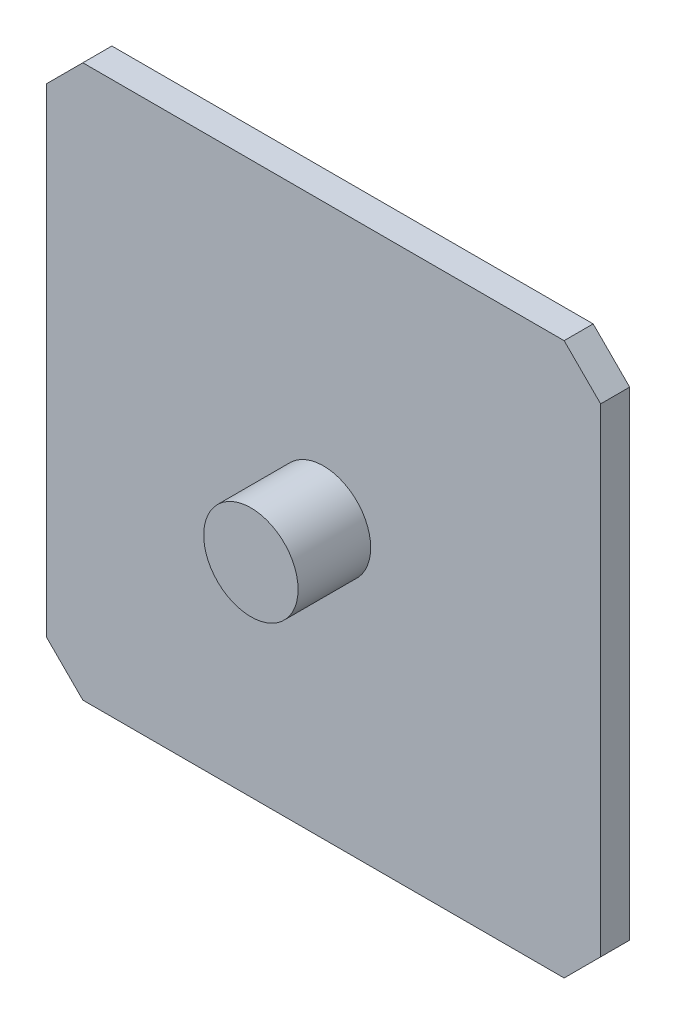
ISO-10303-21;
HEADER;
FILE_DESCRIPTION(('STEP AP214'),'2;1');
FILE_NAME('part.step','',(''),(''),'','','');
FILE_SCHEMA(('AUTOMOTIVE_DESIGN { 1 0 10303 214 1 1 1 1 }'));
ENDSEC;
DATA;
#1=APPLICATION_CONTEXT('core data for automotive mechanical design processes');
#2=APPLICATION_PROTOCOL_DEFINITION('international standard','automotive_design',2000,#1);
#3=PRODUCT_CONTEXT('',#1,'mechanical');
#4=PRODUCT('Part','Part','',(#3));
#5=PRODUCT_RELATED_PRODUCT_CATEGORY('part','',(#4));
#6=PRODUCT_DEFINITION_FORMATION('','',#4);
#7=PRODUCT_DEFINITION_CONTEXT('part definition',#1,'design');
#8=PRODUCT_DEFINITION('design','',#6,#7);
#9=PRODUCT_DEFINITION_SHAPE('','',#8);
#10=(LENGTH_UNIT() NAMED_UNIT(*) SI_UNIT(.MILLI.,.METRE.));
#11=(NAMED_UNIT(*) PLANE_ANGLE_UNIT() SI_UNIT($,.RADIAN.));
#12=(NAMED_UNIT(*) SI_UNIT($,.STERADIAN.) SOLID_ANGLE_UNIT());
#13=UNCERTAINTY_MEASURE_WITH_UNIT(LENGTH_MEASURE(1.E-05),#10,'distance_accuracy_value','');
#14=(GEOMETRIC_REPRESENTATION_CONTEXT(3) GLOBAL_UNCERTAINTY_ASSIGNED_CONTEXT((#13)) GLOBAL_UNIT_ASSIGNED_CONTEXT((#10,
#11,#12)) REPRESENTATION_CONTEXT('',''));
#15=CARTESIAN_POINT('',(0.,0.,0.));
#16=DIRECTION('',(0.,0.,1.));
#17=DIRECTION('',(1.,0.,0.));
#18=AXIS2_PLACEMENT_3D('',#15,#16,#17);
#19=CARTESIAN_POINT('',(16.5751975961023,-19.0093329427343,2.));
#20=DIRECTION('',(-0.707106781186547,0.707106781186547,0.));
#21=DIRECTION('',(-0.707106781186548,-0.707106781186548,0.));
#22=AXIS2_PLACEMENT_3D('',#19,#20,#21);
#23=PLANE('',#22);
#24=DIRECTION('',(0.707106781186548,0.707106781186548,0.));
#25=VECTOR('',#24,1.);
#26=CARTESIAN_POINT('',(16.5751975961023,-19.0093329427343,0.));
#27=LINE('',#26,#25);
#28=CARTESIAN_POINT('',(16.5751975961023,-19.0093329427343,0.));
#29=VERTEX_POINT('',#28);
#30=CARTESIAN_POINT('',(19.0897975961023,-16.4947329427343,0.));
#31=VERTEX_POINT('',#30);
#32=EDGE_CURVE('E129',#29,#31,#27,.T.);
#33=ORIENTED_EDGE('',*,*,#32,.T.);
#34=DIRECTION('',(0.,0.,-1.));
#35=VECTOR('',#34,1.);
#36=CARTESIAN_POINT('',(19.0897975961023,-16.4947329427343,2.));
#37=LINE('',#36,#35);
#38=CARTESIAN_POINT('',(19.0897975961023,-16.4947329427343,2.));
#39=VERTEX_POINT('',#38);
#40=EDGE_CURVE('E11',#39,#31,#37,.T.);
#41=ORIENTED_EDGE('',*,*,#40,.F.);
#42=DIRECTION('',(0.707106781186548,0.707106781186548,0.));
#43=VECTOR('',#42,1.);
#44=CARTESIAN_POINT('',(16.5751975961023,-19.0093329427343,2.));
#45=LINE('',#44,#43);
#46=CARTESIAN_POINT('',(16.5751975961023,-19.0093329427343,2.));
#47=VERTEX_POINT('',#46);
#48=EDGE_CURVE('E144',#47,#39,#45,.T.);
#49=ORIENTED_EDGE('',*,*,#48,.F.);
#50=DIRECTION('',(0.,0.,-1.));
#51=VECTOR('',#50,1.);
#52=CARTESIAN_POINT('',(16.5751975961023,-19.0093329427343,2.));
#53=LINE('',#52,#51);
#54=EDGE_CURVE('E125',#47,#29,#53,.T.);
#55=ORIENTED_EDGE('',*,*,#54,.T.);
#56=EDGE_LOOP('',(#33,#41,#49,#55));
#57=FACE_BOUND('',#56,.T.);
#58=ADVANCED_FACE('F33',(#57),#23,.F.);
#59=CARTESIAN_POINT('',(19.0897975961023,-16.4947329427343,2.));
#60=DIRECTION('',(-1.,0.,0.));
#61=DIRECTION('',(0.,0.,1.));
#62=AXIS2_PLACEMENT_3D('',#59,#60,#61);
#63=PLANE('',#62);
#64=DIRECTION('',(0.,1.,0.));
#65=VECTOR('',#64,1.);
#66=CARTESIAN_POINT('',(19.0897975961023,-16.4947329427343,0.));
#67=LINE('',#66,#65);
#68=CARTESIAN_POINT('',(19.0897975961023,16.4947329427343,0.));
#69=VERTEX_POINT('',#68);
#70=EDGE_CURVE('E132',#31,#69,#67,.T.);
#71=ORIENTED_EDGE('',*,*,#70,.T.);
#72=DIRECTION('',(0.,0.,-1.));
#73=VECTOR('',#72,1.);
#74=CARTESIAN_POINT('',(19.0897975961023,16.4947329427343,2.));
#75=LINE('',#74,#73);
#76=CARTESIAN_POINT('',(19.0897975961023,16.4947329427343,2.));
#77=VERTEX_POINT('',#76);
#78=EDGE_CURVE('E41',#77,#69,#75,.T.);
#79=ORIENTED_EDGE('',*,*,#78,.F.);
#80=DIRECTION('',(0.,1.,0.));
#81=VECTOR('',#80,1.);
#82=CARTESIAN_POINT('',(19.0897975961023,-16.4947329427343,2.));
#83=LINE('',#82,#81);
#84=EDGE_CURVE('E92',#39,#77,#83,.T.);
#85=ORIENTED_EDGE('',*,*,#84,.F.);
#86=ORIENTED_EDGE('',*,*,#40,.T.);
#87=EDGE_LOOP('',(#71,#79,#85,#86));
#88=FACE_BOUND('',#87,.T.);
#89=ADVANCED_FACE('F201',(#88),#63,.F.);
#90=CARTESIAN_POINT('',(19.0897975961023,16.4947329427343,2.));
#91=DIRECTION('',(-0.707106781186547,-0.707106781186547,0.));
#92=DIRECTION('',(0.707106781186548,-0.707106781186548,0.));
#93=AXIS2_PLACEMENT_3D('',#90,#91,#92);
#94=PLANE('',#93);
#95=DIRECTION('',(-0.707106781186548,0.707106781186548,0.));
#96=VECTOR('',#95,1.);
#97=CARTESIAN_POINT('',(19.0897975961023,16.4947329427343,0.));
#98=LINE('',#97,#96);
#99=CARTESIAN_POINT('',(16.5751975961023,19.0093329427343,0.));
#100=VERTEX_POINT('',#99);
#101=EDGE_CURVE('E135',#69,#100,#98,.T.);
#102=ORIENTED_EDGE('',*,*,#101,.T.);
#103=DIRECTION('',(0.,0.,-1.));
#104=VECTOR('',#103,1.);
#105=CARTESIAN_POINT('',(16.5751975961023,19.0093329427343,2.));
#106=LINE('',#105,#104);
#107=CARTESIAN_POINT('',(16.5751975961023,19.0093329427343,2.));
#108=VERTEX_POINT('',#107);
#109=EDGE_CURVE('E151',#108,#100,#106,.T.);
#110=ORIENTED_EDGE('',*,*,#109,.F.);
#111=DIRECTION('',(-0.707106781186548,0.707106781186548,0.));
#112=VECTOR('',#111,1.);
#113=CARTESIAN_POINT('',(19.0897975961023,16.4947329427343,2.));
#114=LINE('',#113,#112);
#115=EDGE_CURVE('E159',#77,#108,#114,.T.);
#116=ORIENTED_EDGE('',*,*,#115,.F.);
#117=ORIENTED_EDGE('',*,*,#78,.T.);
#118=EDGE_LOOP('',(#102,#110,#116,#117));
#119=FACE_BOUND('',#118,.T.);
#120=ADVANCED_FACE('F157',(#119),#94,.F.);
#121=CARTESIAN_POINT('',(16.5751975961023,19.0093329427343,2.));
#122=DIRECTION('',(0.,-1.,0.));
#123=DIRECTION('',(0.,0.,-1.));
#124=AXIS2_PLACEMENT_3D('',#121,#122,#123);
#125=PLANE('',#124);
#126=DIRECTION('',(-1.,0.,0.));
#127=VECTOR('',#126,1.);
#128=CARTESIAN_POINT('',(16.5751975961023,19.0093329427343,0.));
#129=LINE('',#128,#127);
#130=CARTESIAN_POINT('',(-16.5751975961023,19.0093329427343,0.));
#131=VERTEX_POINT('',#130);
#132=EDGE_CURVE('E137',#100,#131,#129,.T.);
#133=ORIENTED_EDGE('',*,*,#132,.T.);
#134=DIRECTION('',(0.,0.,-1.));
#135=VECTOR('',#134,1.);
#136=CARTESIAN_POINT('',(-16.5751975961023,19.0093329427343,2.));
#137=LINE('',#136,#135);
#138=CARTESIAN_POINT('',(-16.5751975961023,19.0093329427343,2.));
#139=VERTEX_POINT('',#138);
#140=EDGE_CURVE('E148',#139,#131,#137,.T.);
#141=ORIENTED_EDGE('',*,*,#140,.F.);
#142=DIRECTION('',(-1.,0.,0.));
#143=VECTOR('',#142,1.);
#144=CARTESIAN_POINT('',(16.5751975961023,19.0093329427343,2.));
#145=LINE('',#144,#143);
#146=EDGE_CURVE('E171',#108,#139,#145,.T.);
#147=ORIENTED_EDGE('',*,*,#146,.F.);
#148=ORIENTED_EDGE('',*,*,#109,.T.);
#149=EDGE_LOOP('',(#133,#141,#147,#148));
#150=FACE_BOUND('',#149,.T.);
#151=ADVANCED_FACE('F167',(#150),#125,.F.);
#152=CARTESIAN_POINT('',(-19.0897975961023,16.4947329427343,2.));
#153=DIRECTION('',(0.707106781186547,-0.707106781186547,0.));
#154=DIRECTION('',(0.707106781186548,0.707106781186548,0.));
#155=AXIS2_PLACEMENT_3D('',#152,#153,#154);
#156=PLANE('',#155);
#157=DIRECTION('',(-0.707106781186548,-0.707106781186548,0.));
#158=VECTOR('',#157,1.);
#159=CARTESIAN_POINT('',(-19.0897975961023,16.4947329427343,0.));
#160=LINE('',#159,#158);
#161=CARTESIAN_POINT('',(-19.0897975961023,16.4947329427343,0.));
#162=VERTEX_POINT('',#161);
#163=EDGE_CURVE('E139',#131,#162,#160,.T.);
#164=ORIENTED_EDGE('',*,*,#163,.T.);
#165=DIRECTION('',(0.,0.,-1.));
#166=VECTOR('',#165,1.);
#167=CARTESIAN_POINT('',(-19.0897975961023,16.4947329427343,2.));
#168=LINE('',#167,#166);
#169=CARTESIAN_POINT('',(-19.0897975961023,16.4947329427343,2.));
#170=VERTEX_POINT('',#169);
#171=EDGE_CURVE('E120',#170,#162,#168,.T.);
#172=ORIENTED_EDGE('',*,*,#171,.F.);
#173=DIRECTION('',(-0.707106781186548,-0.707106781186548,0.));
#174=VECTOR('',#173,1.);
#175=CARTESIAN_POINT('',(-19.0897975961023,16.4947329427343,2.));
#176=LINE('',#175,#174);
#177=EDGE_CURVE('E111',#139,#170,#176,.T.);
#178=ORIENTED_EDGE('',*,*,#177,.F.);
#179=ORIENTED_EDGE('',*,*,#140,.T.);
#180=EDGE_LOOP('',(#164,#172,#178,#179));
#181=FACE_BOUND('',#180,.T.);
#182=ADVANCED_FACE('F170',(#181),#156,.F.);
#183=CARTESIAN_POINT('',(-19.0897975961023,-16.4947329427343,2.));
#184=DIRECTION('',(1.,0.,0.));
#185=DIRECTION('',(0.,0.,-1.));
#186=AXIS2_PLACEMENT_3D('',#183,#184,#185);
#187=PLANE('',#186);
#188=DIRECTION('',(0.,-1.,0.));
#189=VECTOR('',#188,1.);
#190=CARTESIAN_POINT('',(-19.0897975961023,-16.4947329427343,0.));
#191=LINE('',#190,#189);
#192=CARTESIAN_POINT('',(-19.0897975961023,-16.4947329427343,0.));
#193=VERTEX_POINT('',#192);
#194=EDGE_CURVE('E119',#162,#193,#191,.T.);
#195=ORIENTED_EDGE('',*,*,#194,.T.);
#196=DIRECTION('',(0.,0.,-1.));
#197=VECTOR('',#196,1.);
#198=CARTESIAN_POINT('',(-19.0897975961023,-16.4947329427343,2.));
#199=LINE('',#198,#197);
#200=CARTESIAN_POINT('',(-19.0897975961023,-16.4947329427343,2.));
#201=VERTEX_POINT('',#200);
#202=EDGE_CURVE('E116',#201,#193,#199,.T.);
#203=ORIENTED_EDGE('',*,*,#202,.F.);
#204=DIRECTION('',(0.,-1.,0.));
#205=VECTOR('',#204,1.);
#206=CARTESIAN_POINT('',(-19.0897975961023,-16.4947329427343,2.));
#207=LINE('',#206,#205);
#208=EDGE_CURVE('E105',#170,#201,#207,.T.);
#209=ORIENTED_EDGE('',*,*,#208,.F.);
#210=ORIENTED_EDGE('',*,*,#171,.T.);
#211=EDGE_LOOP('',(#195,#203,#209,#210));
#212=FACE_BOUND('',#211,.T.);
#213=ADVANCED_FACE('F117',(#212),#187,.F.);
#214=CARTESIAN_POINT('',(-16.5751975961023,-19.0093329427343,2.));
#215=DIRECTION('',(0.707106781186547,0.707106781186547,0.));
#216=DIRECTION('',(-0.707106781186548,0.707106781186548,0.));
#217=AXIS2_PLACEMENT_3D('',#214,#215,#216);
#218=PLANE('',#217);
#219=DIRECTION('',(0.707106781186548,-0.707106781186548,0.));
#220=VECTOR('',#219,1.);
#221=CARTESIAN_POINT('',(-16.5751975961023,-19.0093329427343,0.));
#222=LINE('',#221,#220);
#223=CARTESIAN_POINT('',(-16.5751975961023,-19.0093329427343,0.));
#224=VERTEX_POINT('',#223);
#225=EDGE_CURVE('E78',#193,#224,#222,.T.);
#226=ORIENTED_EDGE('',*,*,#225,.T.);
#227=DIRECTION('',(0.,0.,-1.));
#228=VECTOR('',#227,1.);
#229=CARTESIAN_POINT('',(-16.5751975961023,-19.0093329427343,2.));
#230=LINE('',#229,#228);
#231=CARTESIAN_POINT('',(-16.5751975961023,-19.0093329427343,2.));
#232=VERTEX_POINT('',#231);
#233=EDGE_CURVE('E121',#232,#224,#230,.T.);
#234=ORIENTED_EDGE('',*,*,#233,.F.);
#235=DIRECTION('',(0.707106781186548,-0.707106781186548,0.));
#236=VECTOR('',#235,1.);
#237=CARTESIAN_POINT('',(-16.5751975961023,-19.0093329427343,2.));
#238=LINE('',#237,#236);
#239=EDGE_CURVE('E109',#201,#232,#238,.T.);
#240=ORIENTED_EDGE('',*,*,#239,.F.);
#241=ORIENTED_EDGE('',*,*,#202,.T.);
#242=EDGE_LOOP('',(#226,#234,#240,#241));
#243=FACE_BOUND('',#242,.T.);
#244=ADVANCED_FACE('F123',(#243),#218,.F.);
#245=CARTESIAN_POINT('',(16.5751975961023,-19.0093329427343,2.));
#246=DIRECTION('',(0.,1.,0.));
#247=DIRECTION('',(0.,0.,1.));
#248=AXIS2_PLACEMENT_3D('',#245,#246,#247);
#249=PLANE('',#248);
#250=DIRECTION('',(1.,0.,0.));
#251=VECTOR('',#250,1.);
#252=CARTESIAN_POINT('',(16.5751975961023,-19.0093329427343,0.));
#253=LINE('',#252,#251);
#254=EDGE_CURVE('E84',#224,#29,#253,.T.);
#255=ORIENTED_EDGE('',*,*,#254,.T.);
#256=ORIENTED_EDGE('',*,*,#54,.F.);
#257=DIRECTION('',(1.,0.,0.));
#258=VECTOR('',#257,1.);
#259=CARTESIAN_POINT('',(16.5751975961023,-19.0093329427343,2.));
#260=LINE('',#259,#258);
#261=EDGE_CURVE('E49',#232,#47,#260,.T.);
#262=ORIENTED_EDGE('',*,*,#261,.F.);
#263=ORIENTED_EDGE('',*,*,#233,.T.);
#264=EDGE_LOOP('',(#255,#256,#262,#263));
#265=FACE_BOUND('',#264,.T.);
#266=ADVANCED_FACE('F192',(#265),#249,.F.);
#267=CARTESIAN_POINT('',(0.,0.,2.));
#268=DIRECTION('',(0.,0.,1.));
#269=DIRECTION('',(1.,0.,0.));
#270=AXIS2_PLACEMENT_3D('',#267,#268,#269);
#271=PLANE('',#270);
#272=CARTESIAN_POINT('',(0.,0.,2.));
#273=DIRECTION('',(0.,0.,1.));
#274=DIRECTION('',(1.,0.,0.));
#275=AXIS2_PLACEMENT_3D('',#272,#273,#274);
#276=CIRCLE('',#275,3.2512);
#277=CARTESIAN_POINT('',(3.2512,0.,2.));
#278=VERTEX_POINT('',#277);
#279=EDGE_CURVE('E177',#278,#278,#276,.T.);
#280=ORIENTED_EDGE('',*,*,#279,.F.);
#281=EDGE_LOOP('',(#280));
#282=FACE_BOUND('',#281,.T.);
#283=ORIENTED_EDGE('',*,*,#48,.T.);
#284=ORIENTED_EDGE('',*,*,#84,.T.);
#285=ORIENTED_EDGE('',*,*,#115,.T.);
#286=ORIENTED_EDGE('',*,*,#146,.T.);
#287=ORIENTED_EDGE('',*,*,#177,.T.);
#288=ORIENTED_EDGE('',*,*,#208,.T.);
#289=ORIENTED_EDGE('',*,*,#239,.T.);
#290=ORIENTED_EDGE('',*,*,#261,.T.);
#291=EDGE_LOOP('',(#283,#284,#285,#286,#287,#288,#289,#290));
#292=FACE_BOUND('',#291,.T.);
#293=ADVANCED_FACE('F107',(#282,#292),#271,.T.);
#294=CARTESIAN_POINT('',(0.,0.,0.));
#295=DIRECTION('',(0.,0.,1.));
#296=DIRECTION('',(1.,0.,0.));
#297=AXIS2_PLACEMENT_3D('',#294,#295,#296);
#298=PLANE('',#297);
#299=ORIENTED_EDGE('',*,*,#32,.F.);
#300=ORIENTED_EDGE('',*,*,#254,.F.);
#301=ORIENTED_EDGE('',*,*,#225,.F.);
#302=ORIENTED_EDGE('',*,*,#194,.F.);
#303=ORIENTED_EDGE('',*,*,#163,.F.);
#304=ORIENTED_EDGE('',*,*,#132,.F.);
#305=ORIENTED_EDGE('',*,*,#101,.F.);
#306=ORIENTED_EDGE('',*,*,#70,.F.);
#307=EDGE_LOOP('',(#299,#300,#301,#302,#303,#304,#305,#306));
#308=FACE_BOUND('',#307,.T.);
#309=ADVANCED_FACE('F163',(#308),#298,.F.);
#310=CARTESIAN_POINT('',(0.,0.,7.));
#311=DIRECTION('',(0.,0.,-1.));
#312=DIRECTION('',(-1.,0.,0.));
#313=AXIS2_PLACEMENT_3D('',#310,#311,#312);
#314=CYLINDRICAL_SURFACE('',#313,3.2512);
#315=CARTESIAN_POINT('',(0.,0.,7.));
#316=DIRECTION('',(0.,0.,1.));
#317=DIRECTION('',(1.,0.,0.));
#318=AXIS2_PLACEMENT_3D('',#315,#316,#317);
#319=CIRCLE('',#318,3.2512);
#320=CARTESIAN_POINT('',(3.2512,0.,7.));
#321=VERTEX_POINT('',#320);
#322=EDGE_CURVE('E133',#321,#321,#319,.T.);
#323=ORIENTED_EDGE('',*,*,#322,.F.);
#324=EDGE_LOOP('',(#323));
#325=FACE_BOUND('',#324,.T.);
#326=ORIENTED_EDGE('',*,*,#279,.T.);
#327=EDGE_LOOP('',(#326));
#328=FACE_BOUND('',#327,.T.);
#329=ADVANCED_FACE('F185',(#325,#328),#314,.T.);
#330=CARTESIAN_POINT('',(0.,0.,7.));
#331=DIRECTION('',(0.,0.,1.));
#332=DIRECTION('',(1.,0.,0.));
#333=AXIS2_PLACEMENT_3D('',#330,#331,#332);
#334=PLANE('',#333);
#335=ORIENTED_EDGE('',*,*,#322,.T.);
#336=EDGE_LOOP('',(#335));
#337=FACE_BOUND('',#336,.T.);
#338=ADVANCED_FACE('F183',(#337),#334,.T.);
#339=CLOSED_SHELL('',(#58,#89,#120,#151,#182,#213,#244,#266,#293,#309,#329,#338));
#340=MANIFOLD_SOLID_BREP('B2',#339);
#341=ADVANCED_BREP_SHAPE_REPRESENTATION('',(#18,#340),#14);
#342=SHAPE_DEFINITION_REPRESENTATION(#9,#341);
ENDSEC;
END-ISO-10303-21;
